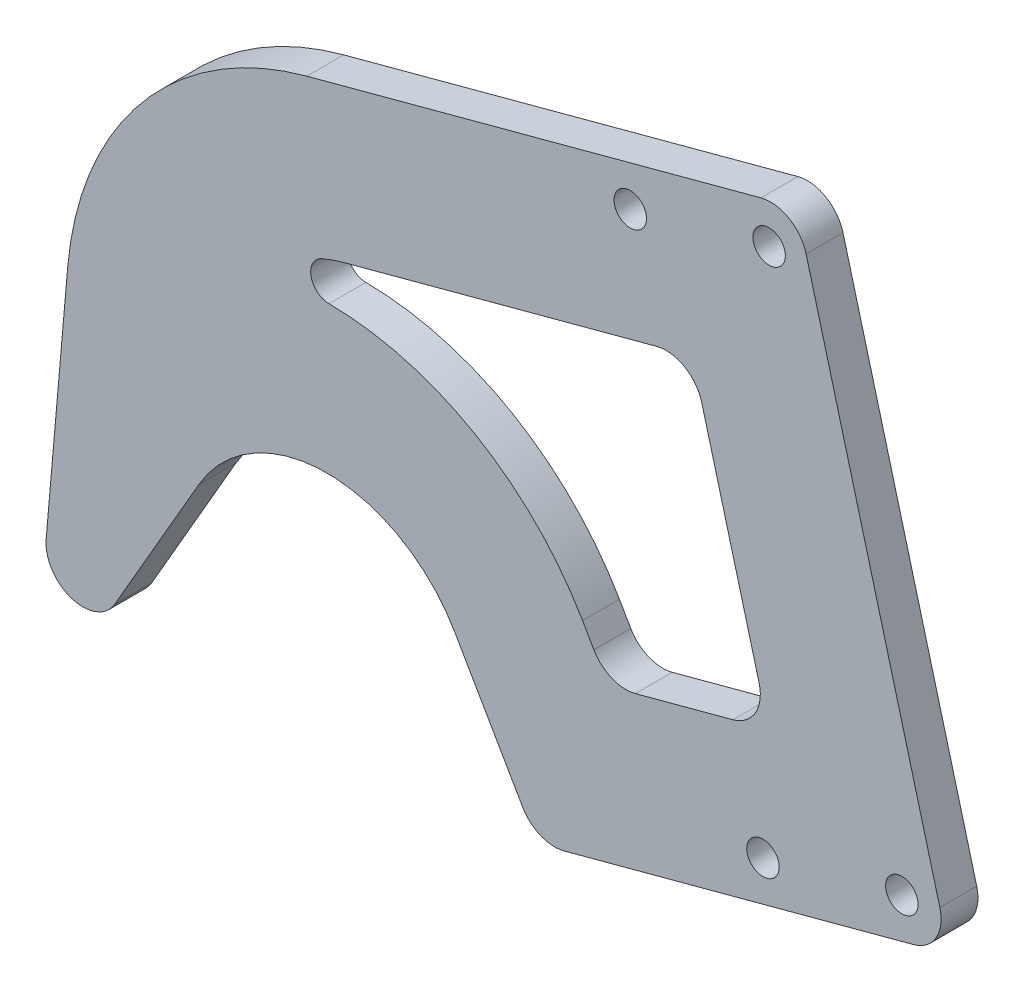
ISO-10303-21;
HEADER;
FILE_DESCRIPTION(('STEP AP214'),'2;1');
FILE_NAME('part.step','',(''),(''),'','','');
FILE_SCHEMA(('AUTOMOTIVE_DESIGN { 1 0 10303 214 1 1 1 1 }'));
ENDSEC;
DATA;
#1=APPLICATION_CONTEXT('core data for automotive mechanical design processes');
#2=APPLICATION_PROTOCOL_DEFINITION('international standard','automotive_design',2000,#1);
#3=PRODUCT_CONTEXT('',#1,'mechanical');
#4=PRODUCT('Part','Part','',(#3));
#5=PRODUCT_RELATED_PRODUCT_CATEGORY('part','',(#4));
#6=PRODUCT_DEFINITION_FORMATION('','',#4);
#7=PRODUCT_DEFINITION_CONTEXT('part definition',#1,'design');
#8=PRODUCT_DEFINITION('design','',#6,#7);
#9=PRODUCT_DEFINITION_SHAPE('','',#8);
#10=(LENGTH_UNIT() NAMED_UNIT(*) SI_UNIT(.MILLI.,.METRE.));
#11=(NAMED_UNIT(*) PLANE_ANGLE_UNIT() SI_UNIT($,.RADIAN.));
#12=(NAMED_UNIT(*) SI_UNIT($,.STERADIAN.) SOLID_ANGLE_UNIT());
#13=UNCERTAINTY_MEASURE_WITH_UNIT(LENGTH_MEASURE(1.E-05),#10,'distance_accuracy_value','');
#14=(GEOMETRIC_REPRESENTATION_CONTEXT(3) GLOBAL_UNCERTAINTY_ASSIGNED_CONTEXT((#13)) GLOBAL_UNIT_ASSIGNED_CONTEXT((#10,
#11,#12)) REPRESENTATION_CONTEXT('',''));
#15=CARTESIAN_POINT('',(0.,0.,0.));
#16=DIRECTION('',(0.,0.,1.));
#17=DIRECTION('',(1.,0.,0.));
#18=AXIS2_PLACEMENT_3D('',#15,#16,#17);
#19=CARTESIAN_POINT('',(0.,17.3058666666666,1.5875));
#20=DIRECTION('',(0.,0.,-1.));
#21=DIRECTION('',(-1.,0.,0.));
#22=AXIS2_PLACEMENT_3D('',#19,#20,#21);
#23=CYLINDRICAL_SURFACE('',#22,12.7);
#24=CARTESIAN_POINT('',(0.,17.3058666666666,-1.5875));
#25=DIRECTION('',(0.,0.,-1.));
#26=DIRECTION('',(-1.,0.,0.));
#27=AXIS2_PLACEMENT_3D('',#24,#25,#26);
#28=CIRCLE('',#27,12.7);
#29=CARTESIAN_POINT('',(-10.9985226280624,23.6558666666666,-1.5875));
#30=VERTEX_POINT('',#29);
#31=CARTESIAN_POINT('',(10.9985226280624,23.6558666666666,-1.5875));
#32=VERTEX_POINT('',#31);
#33=EDGE_CURVE('E258',#30,#32,#28,.T.);
#34=ORIENTED_EDGE('',*,*,#33,.T.);
#35=DIRECTION('',(0.,0.,-1.));
#36=VECTOR('',#35,1.);
#37=CARTESIAN_POINT('',(10.9985226280624,23.6558666666666,1.5875));
#38=LINE('',#37,#36);
#39=CARTESIAN_POINT('',(10.9985226280624,23.6558666666666,1.5875));
#40=VERTEX_POINT('',#39);
#41=EDGE_CURVE('E353',#40,#32,#38,.T.);
#42=ORIENTED_EDGE('',*,*,#41,.F.);
#43=CARTESIAN_POINT('',(0.,17.3058666666666,1.5875));
#44=DIRECTION('',(0.,0.,-1.));
#45=DIRECTION('',(-1.,0.,0.));
#46=AXIS2_PLACEMENT_3D('',#43,#44,#45);
#47=CIRCLE('',#46,12.7);
#48=CARTESIAN_POINT('',(-10.9985226280624,23.6558666666666,1.5875));
#49=VERTEX_POINT('',#48);
#50=EDGE_CURVE('E260',#49,#40,#47,.T.);
#51=ORIENTED_EDGE('',*,*,#50,.F.);
#52=DIRECTION('',(0.,0.,-1.));
#53=VECTOR('',#52,1.);
#54=CARTESIAN_POINT('',(-10.9985226280624,23.6558666666666,1.5875));
#55=LINE('',#54,#53);
#56=EDGE_CURVE('E294',#49,#30,#55,.T.);
#57=ORIENTED_EDGE('',*,*,#56,.T.);
#58=EDGE_LOOP('',(#34,#42,#51,#57));
#59=FACE_BOUND('',#58,.T.);
#60=ADVANCED_FACE('F45',(#59),#23,.F.);
#61=CARTESIAN_POINT('',(10.9985226280624,23.6558666666666,1.5875));
#62=DIRECTION('',(0.866025403784439,0.499999999999999,0.));
#63=DIRECTION('',(-0.499999999999999,0.86602540378444,0.));
#64=AXIS2_PLACEMENT_3D('',#61,#62,#63);
#65=PLANE('',#64);
#66=DIRECTION('',(0.499999999999999,-0.866025403784439,0.));
#67=VECTOR('',#66,1.);
#68=CARTESIAN_POINT('',(10.9985226280624,23.6558666666666,-1.5875));
#69=LINE('',#68,#67);
#70=CARTESIAN_POINT('',(16.8477998671147,13.5246213010718,-1.5875));
#71=VERTEX_POINT('',#70);
#72=EDGE_CURVE('E298',#32,#71,#69,.T.);
#73=ORIENTED_EDGE('',*,*,#72,.T.);
#74=DIRECTION('',(0.,0.,-1.));
#75=VECTOR('',#74,1.);
#76=CARTESIAN_POINT('',(16.8477998671147,13.5246213010718,1.5875));
#77=LINE('',#76,#75);
#78=CARTESIAN_POINT('',(16.8477998671147,13.5246213010718,1.5875));
#79=VERTEX_POINT('',#78);
#80=EDGE_CURVE('E349',#79,#71,#77,.T.);
#81=ORIENTED_EDGE('',*,*,#80,.F.);
#82=DIRECTION('',(0.499999999999999,-0.866025403784439,0.));
#83=VECTOR('',#82,1.);
#84=CARTESIAN_POINT('',(10.9985226280624,23.6558666666666,1.5875));
#85=LINE('',#84,#83);
#86=EDGE_CURVE('E264',#40,#79,#85,.T.);
#87=ORIENTED_EDGE('',*,*,#86,.F.);
#88=ORIENTED_EDGE('',*,*,#41,.T.);
#89=EDGE_LOOP('',(#73,#81,#87,#88));
#90=FACE_BOUND('',#89,.T.);
#91=ADVANCED_FACE('F465',(#90),#65,.F.);
#92=CARTESIAN_POINT('',(19.5974305241302,15.1121213010718,1.5875));
#93=DIRECTION('',(0.,0.,-1.));
#94=DIRECTION('',(-1.,0.,0.));
#95=AXIS2_PLACEMENT_3D('',#92,#93,#94);
#96=CYLINDRICAL_SURFACE('',#95,3.175);
#97=CARTESIAN_POINT('',(19.5974305241302,15.1121213010718,-1.5875));
#98=DIRECTION('',(0.,0.,1.));
#99=DIRECTION('',(1.,0.,0.));
#100=AXIS2_PLACEMENT_3D('',#97,#98,#99);
#101=CIRCLE('',#100,3.175);
#102=CARTESIAN_POINT('',(20.4191809923307,12.045306802604,-1.5875));
#103=VERTEX_POINT('',#102);
#104=EDGE_CURVE('E301',#71,#103,#101,.T.);
#105=ORIENTED_EDGE('',*,*,#104,.T.);
#106=DIRECTION('',(0.,0.,-1.));
#107=VECTOR('',#106,1.);
#108=CARTESIAN_POINT('',(20.4191809923307,12.045306802604,1.5875));
#109=LINE('',#108,#107);
#110=CARTESIAN_POINT('',(20.4191809923307,12.045306802604,1.5875));
#111=VERTEX_POINT('',#110);
#112=EDGE_CURVE('E345',#111,#103,#109,.T.);
#113=ORIENTED_EDGE('',*,*,#112,.F.);
#114=CARTESIAN_POINT('',(19.5974305241302,15.1121213010718,1.5875));
#115=DIRECTION('',(0.,0.,1.));
#116=DIRECTION('',(1.,0.,0.));
#117=AXIS2_PLACEMENT_3D('',#114,#115,#116);
#118=CIRCLE('',#117,3.175);
#119=EDGE_CURVE('E268',#79,#111,#118,.T.);
#120=ORIENTED_EDGE('',*,*,#119,.F.);
#121=ORIENTED_EDGE('',*,*,#80,.T.);
#122=EDGE_LOOP('',(#105,#113,#120,#121));
#123=FACE_BOUND('',#122,.T.);
#124=ADVANCED_FACE('F471',(#123),#96,.T.);
#125=CARTESIAN_POINT('',(20.4191809923308,12.045306802604,1.5875));
#126=DIRECTION('',(-0.258819045102522,0.965925826289068,0.));
#127=DIRECTION('',(-0.965925826289068,-0.258819045102522,0.));
#128=AXIS2_PLACEMENT_3D('',#125,#126,#127);
#129=PLANE('',#128);
#130=DIRECTION('',(0.965925826289068,0.258819045102522,0.));
#131=VECTOR('',#130,1.);
#132=CARTESIAN_POINT('',(20.4191809923308,12.045306802604,-1.5875));
#133=LINE('',#132,#131);
#134=CARTESIAN_POINT('',(50.4923455375514,20.1033869563442,-1.5875));
#135=VERTEX_POINT('',#134);
#136=EDGE_CURVE('E304',#103,#135,#133,.T.);
#137=ORIENTED_EDGE('',*,*,#136,.T.);
#138=DIRECTION('',(0.,0.,-1.));
#139=VECTOR('',#138,1.);
#140=CARTESIAN_POINT('',(50.4923455375514,20.1033869563442,1.5875));
#141=LINE('',#140,#139);
#142=CARTESIAN_POINT('',(50.4923455375514,20.1033869563442,1.5875));
#143=VERTEX_POINT('',#142);
#144=EDGE_CURVE('E370',#135,#143,#141,.F.);
#145=ORIENTED_EDGE('',*,*,#144,.T.);
#146=DIRECTION('',(0.965925826289068,0.258819045102522,0.));
#147=VECTOR('',#146,1.);
#148=CARTESIAN_POINT('',(20.4191809923308,12.045306802604,1.5875));
#149=LINE('',#148,#147);
#150=EDGE_CURVE('E271',#111,#143,#149,.T.);
#151=ORIENTED_EDGE('',*,*,#150,.F.);
#152=ORIENTED_EDGE('',*,*,#112,.T.);
#153=EDGE_LOOP('',(#137,#145,#151,#152));
#154=FACE_BOUND('',#153,.T.);
#155=ADVANCED_FACE('F638',(#154),#129,.F.);
#156=CARTESIAN_POINT('',(53.5591600360192,20.9251374245447,1.5875));
#157=DIRECTION('',(-0.965925826289068,-0.258819045102521,0.));
#158=DIRECTION('',(0.258819045102521,-0.965925826289068,0.));
#159=AXIS2_PLACEMENT_3D('',#156,#157,#158);
#160=PLANE('',#159);
#161=DIRECTION('',(-0.258819045102521,0.965925826289068,0.));
#162=VECTOR('',#161,1.);
#163=CARTESIAN_POINT('',(53.5591600360192,20.9251374245447,1.5875));
#164=LINE('',#163,#162);
#165=CARTESIAN_POINT('',(52.7374095678187,23.9919519230125,1.5875));
#166=VERTEX_POINT('',#165);
#167=CARTESIAN_POINT('',(41.2329030130117,66.9273549015616,1.5875));
#168=VERTEX_POINT('',#167);
#169=EDGE_CURVE('E275',#166,#168,#164,.T.);
#170=ORIENTED_EDGE('',*,*,#169,.F.);
#171=DIRECTION('',(0.,0.,-1.));
#172=VECTOR('',#171,1.);
#173=CARTESIAN_POINT('',(52.7374095678187,23.9919519230125,1.5875));
#174=LINE('',#173,#172);
#175=CARTESIAN_POINT('',(52.7374095678187,23.9919519230125,-1.5875));
#176=VERTEX_POINT('',#175);
#177=EDGE_CURVE('E360',#166,#176,#174,.T.);
#178=ORIENTED_EDGE('',*,*,#177,.T.);
#179=DIRECTION('',(-0.258819045102521,0.965925826289068,0.));
#180=VECTOR('',#179,1.);
#181=CARTESIAN_POINT('',(53.5591600360192,20.9251374245447,-1.5875));
#182=LINE('',#181,#180);
#183=CARTESIAN_POINT('',(41.2329030130117,66.9273549015616,-1.5875));
#184=VERTEX_POINT('',#183);
#185=EDGE_CURVE('E308',#176,#184,#182,.T.);
#186=ORIENTED_EDGE('',*,*,#185,.T.);
#187=DIRECTION('',(0.,0.,-1.));
#188=VECTOR('',#187,1.);
#189=CARTESIAN_POINT('',(41.2329030130116,66.9273549015616,1.5875));
#190=LINE('',#189,#188);
#191=EDGE_CURVE('E357',#184,#168,#190,.F.);
#192=ORIENTED_EDGE('',*,*,#191,.T.);
#193=EDGE_LOOP('',(#170,#178,#186,#192));
#194=FACE_BOUND('',#193,.T.);
#195=ADVANCED_FACE('F629',(#194),#160,.F.);
#196=CARTESIAN_POINT('',(-1.72065451339829,58.7049857231183,1.5875));
#197=DIRECTION('',(0.258819045102522,-0.965925826289068,0.));
#198=DIRECTION('',(0.965925826289068,0.258819045102522,0.));
#199=AXIS2_PLACEMENT_3D('',#196,#197,#198);
#200=PLANE('',#199);
#201=DIRECTION('',(-0.965925826289068,-0.258819045102522,0.));
#202=VECTOR('',#201,1.);
#203=CARTESIAN_POINT('',(-1.72065451339829,58.7049857231183,1.5875));
#204=LINE('',#203,#202);
#205=CARTESIAN_POINT('',(37.3443380463433,69.1724189318289,1.5875));
#206=VERTEX_POINT('',#205);
#207=CARTESIAN_POINT('',(-1.72065451339829,58.7049857231183,1.5875));
#208=VERTEX_POINT('',#207);
#209=EDGE_CURVE('E279',#206,#208,#204,.T.);
#210=ORIENTED_EDGE('',*,*,#209,.F.);
#211=DIRECTION('',(0.,0.,-1.));
#212=VECTOR('',#211,1.);
#213=CARTESIAN_POINT('',(37.3443380463433,69.1724189318289,1.5875));
#214=LINE('',#213,#212);
#215=CARTESIAN_POINT('',(37.3443380463433,69.1724189318289,-1.5875));
#216=VERTEX_POINT('',#215);
#217=EDGE_CURVE('E379',#206,#216,#214,.T.);
#218=ORIENTED_EDGE('',*,*,#217,.T.);
#219=DIRECTION('',(-0.965925826289068,-0.258819045102522,0.));
#220=VECTOR('',#219,1.);
#221=CARTESIAN_POINT('',(-1.72065451339829,58.7049857231183,-1.5875));
#222=LINE('',#221,#220);
#223=CARTESIAN_POINT('',(-1.72065451339829,58.7049857231183,-1.5875));
#224=VERTEX_POINT('',#223);
#225=EDGE_CURVE('E312',#216,#224,#222,.T.);
#226=ORIENTED_EDGE('',*,*,#225,.T.);
#227=DIRECTION('',(0.,0.,-1.));
#228=VECTOR('',#227,1.);
#229=CARTESIAN_POINT('',(-1.72065451339829,58.7049857231183,1.5875));
#230=LINE('',#229,#228);
#231=EDGE_CURVE('E341',#208,#224,#230,.T.);
#232=ORIENTED_EDGE('',*,*,#231,.F.);
#233=EDGE_LOOP('',(#210,#218,#226,#232));
#234=FACE_BOUND('',#233,.T.);
#235=ADVANCED_FACE('F624',(#234),#200,.F.);
#236=CARTESIAN_POINT('',(5.50191214310372,31.75,1.5875));
#237=DIRECTION('',(0.,0.,-1.));
#238=DIRECTION('',(-1.,0.,0.));
#239=AXIS2_PLACEMENT_3D('',#236,#237,#238);
#240=CYLINDRICAL_SURFACE('',#239,27.9058546624382);
#241=CARTESIAN_POINT('',(5.50191214310372,31.75,-1.5875));
#242=DIRECTION('',(0.,0.,1.));
#243=DIRECTION('',(1.,0.,0.));
#244=AXIS2_PLACEMENT_3D('',#241,#242,#243);
#245=CIRCLE('',#244,27.9058546624382);
#246=CARTESIAN_POINT('',(-22.297752317336,34.1821554901132,-1.5875));
#247=VERTEX_POINT('',#246);
#248=EDGE_CURVE('E315',#224,#247,#245,.T.);
#249=ORIENTED_EDGE('',*,*,#248,.T.);
#250=DIRECTION('',(0.,0.,-1.));
#251=VECTOR('',#250,1.);
#252=CARTESIAN_POINT('',(-22.297752317336,34.1821554901132,1.5875));
#253=LINE('',#252,#251);
#254=CARTESIAN_POINT('',(-22.297752317336,34.1821554901132,1.5875));
#255=VERTEX_POINT('',#254);
#256=EDGE_CURVE('E337',#255,#247,#253,.T.);
#257=ORIENTED_EDGE('',*,*,#256,.F.);
#258=CARTESIAN_POINT('',(5.50191214310372,31.75,1.5875));
#259=DIRECTION('',(0.,0.,1.));
#260=DIRECTION('',(1.,0.,0.));
#261=AXIS2_PLACEMENT_3D('',#258,#259,#260);
#262=CIRCLE('',#261,27.9058546624382);
#263=EDGE_CURVE('E282',#208,#255,#262,.T.);
#264=ORIENTED_EDGE('',*,*,#263,.F.);
#265=ORIENTED_EDGE('',*,*,#231,.T.);
#266=EDGE_LOOP('',(#249,#257,#264,#265));
#267=FACE_BOUND('',#266,.T.);
#268=ADVANCED_FACE('F628',(#267),#240,.T.);
#269=CARTESIAN_POINT('',(-24.1529875730634,12.9767194832238,1.5875));
#270=DIRECTION('',(0.996194698091745,-0.0871557427476642,0.));
#271=DIRECTION('',(0.0871557427476642,0.996194698091745,0.));
#272=AXIS2_PLACEMENT_3D('',#269,#270,#271);
#273=PLANE('',#272);
#274=DIRECTION('',(-0.0871557427476642,-0.996194698091745,0.));
#275=VECTOR('',#274,1.);
#276=CARTESIAN_POINT('',(-24.1529875730634,12.9767194832238,-1.5875));
#277=LINE('',#276,#275);
#278=CARTESIAN_POINT('',(-24.1529875730634,12.9767194832238,-1.5875));
#279=VERTEX_POINT('',#278);
#280=EDGE_CURVE('E318',#247,#279,#277,.T.);
#281=ORIENTED_EDGE('',*,*,#280,.T.);
#282=DIRECTION('',(0.,0.,-1.));
#283=VECTOR('',#282,1.);
#284=CARTESIAN_POINT('',(-24.1529875730634,12.9767194832238,1.5875));
#285=LINE('',#284,#283);
#286=CARTESIAN_POINT('',(-24.1529875730634,12.9767194832238,1.5875));
#287=VERTEX_POINT('',#286);
#288=EDGE_CURVE('E333',#287,#279,#285,.T.);
#289=ORIENTED_EDGE('',*,*,#288,.F.);
#290=DIRECTION('',(-0.0871557427476642,-0.996194698091745,0.));
#291=VECTOR('',#290,1.);
#292=CARTESIAN_POINT('',(-24.1529875730634,12.9767194832238,1.5875));
#293=LINE('',#292,#291);
#294=EDGE_CURVE('E285',#255,#287,#293,.T.);
#295=ORIENTED_EDGE('',*,*,#294,.F.);
#296=ORIENTED_EDGE('',*,*,#256,.T.);
#297=EDGE_LOOP('',(#281,#289,#295,#296));
#298=FACE_BOUND('',#297,.T.);
#299=ADVANCED_FACE('F673',(#298),#273,.F.);
#300=CARTESIAN_POINT('',(-20.9900694066221,12.7,1.5875));
#301=DIRECTION('',(0.,0.,-1.));
#302=DIRECTION('',(-1.,0.,0.));
#303=AXIS2_PLACEMENT_3D('',#300,#301,#302);
#304=CYLINDRICAL_SURFACE('',#303,3.175);
#305=CARTESIAN_POINT('',(-20.9900694066221,12.7,-1.5875));
#306=DIRECTION('',(0.,0.,1.));
#307=DIRECTION('',(1.,0.,0.));
#308=AXIS2_PLACEMENT_3D('',#305,#306,#307);
#309=CIRCLE('',#308,3.175);
#310=CARTESIAN_POINT('',(-18.2404387496065,11.1125,-1.5875));
#311=VERTEX_POINT('',#310);
#312=EDGE_CURVE('E321',#279,#311,#309,.T.);
#313=ORIENTED_EDGE('',*,*,#312,.T.);
#314=DIRECTION('',(0.,0.,-1.));
#315=VECTOR('',#314,1.);
#316=CARTESIAN_POINT('',(-18.2404387496065,11.1125,1.5875));
#317=LINE('',#316,#315);
#318=CARTESIAN_POINT('',(-18.2404387496065,11.1125,1.5875));
#319=VERTEX_POINT('',#318);
#320=EDGE_CURVE('E329',#319,#311,#317,.T.);
#321=ORIENTED_EDGE('',*,*,#320,.F.);
#322=CARTESIAN_POINT('',(-20.9900694066221,12.7,1.5875));
#323=DIRECTION('',(0.,0.,1.));
#324=DIRECTION('',(1.,0.,0.));
#325=AXIS2_PLACEMENT_3D('',#322,#323,#324);
#326=CIRCLE('',#325,3.175);
#327=EDGE_CURVE('E288',#287,#319,#326,.T.);
#328=ORIENTED_EDGE('',*,*,#327,.F.);
#329=ORIENTED_EDGE('',*,*,#288,.T.);
#330=EDGE_LOOP('',(#313,#321,#328,#329));
#331=FACE_BOUND('',#330,.T.);
#332=ADVANCED_FACE('F682',(#331),#304,.T.);
#333=CARTESIAN_POINT('',(-10.9985226280624,23.6558666666666,1.5875));
#334=DIRECTION('',(-0.866025403784439,0.5,0.));
#335=DIRECTION('',(-0.5,-0.866025403784439,0.));
#336=AXIS2_PLACEMENT_3D('',#333,#334,#335);
#337=PLANE('',#336);
#338=DIRECTION('',(0.5,0.866025403784439,0.));
#339=VECTOR('',#338,1.);
#340=CARTESIAN_POINT('',(-10.9985226280624,23.6558666666666,-1.5875));
#341=LINE('',#340,#339);
#342=EDGE_CURVE('E265',#311,#30,#341,.T.);
#343=ORIENTED_EDGE('',*,*,#342,.T.);
#344=ORIENTED_EDGE('',*,*,#56,.F.);
#345=DIRECTION('',(0.5,0.866025403784439,0.));
#346=VECTOR('',#345,1.);
#347=CARTESIAN_POINT('',(-10.9985226280624,23.6558666666666,1.5875));
#348=LINE('',#347,#346);
#349=EDGE_CURVE('E291',#319,#49,#348,.T.);
#350=ORIENTED_EDGE('',*,*,#349,.F.);
#351=ORIENTED_EDGE('',*,*,#320,.T.);
#352=EDGE_LOOP('',(#343,#344,#350,#351));
#353=FACE_BOUND('',#352,.T.);
#354=ADVANCED_FACE('F504',(#353),#337,.F.);
#355=CARTESIAN_POINT('',(0.,17.3058666666666,1.5875));
#356=DIRECTION('',(0.,0.,-1.));
#357=DIRECTION('',(-1.,0.,0.));
#358=AXIS2_PLACEMENT_3D('',#355,#356,#357);
#359=PLANE('',#358);
#360=CARTESIAN_POINT('',(37.5200804050536,20.0854049602765,1.5875));
#361=DIRECTION('',(0.,0.,-1.));
#362=DIRECTION('',(-1.,0.,0.));
#363=AXIS2_PLACEMENT_3D('',#360,#361,#362);
#364=CIRCLE('',#363,1.39699999999982);
#365=CARTESIAN_POINT('',(36.1230804050538,20.0854049602765,1.5875));
#366=VERTEX_POINT('',#365);
#367=EDGE_CURVE('E239',#366,#366,#364,.T.);
#368=ORIENTED_EDGE('',*,*,#367,.T.);
#369=EDGE_LOOP('',(#368));
#370=FACE_BOUND('',#369,.T.);
#371=CARTESIAN_POINT('',(26.1010358989393,62.701859230985,1.5875));
#372=DIRECTION('',(0.,0.,-1.));
#373=DIRECTION('',(-1.,0.,0.));
#374=AXIS2_PLACEMENT_3D('',#371,#372,#373);
#375=CIRCLE('',#374,1.39699999999982);
#376=CARTESIAN_POINT('',(24.7040358989395,62.701859230985,1.5875));
#377=VERTEX_POINT('',#376);
#378=EDGE_CURVE('E759',#377,#377,#375,.T.);
#379=ORIENTED_EDGE('',*,*,#378,.T.);
#380=EDGE_LOOP('',(#379));
#381=FACE_BOUND('',#380,.T.);
#382=CARTESIAN_POINT('',(38.0493451849699,65.9033990550941,1.5875));
#383=DIRECTION('',(0.,0.,-1.));
#384=DIRECTION('',(-1.,0.,0.));
#385=AXIS2_PLACEMENT_3D('',#382,#383,#384);
#386=CIRCLE('',#385,1.39699999999981);
#387=CARTESIAN_POINT('',(36.6523451849701,65.9033990550941,1.5875));
#388=VERTEX_POINT('',#387);
#389=EDGE_CURVE('E769',#388,#388,#386,.T.);
#390=ORIENTED_EDGE('',*,*,#389,.T.);
#391=EDGE_LOOP('',(#390));
#392=FACE_BOUND('',#391,.T.);
#393=CARTESIAN_POINT('',(49.4683896910841,23.2869447843857,1.5875));
#394=DIRECTION('',(0.,0.,-1.));
#395=DIRECTION('',(-1.,0.,0.));
#396=AXIS2_PLACEMENT_3D('',#393,#394,#395);
#397=CIRCLE('',#396,1.39699999999982);
#398=CARTESIAN_POINT('',(48.0713896910843,23.2869447843857,1.5875));
#399=VERTEX_POINT('',#398);
#400=EDGE_CURVE('E776',#399,#399,#397,.T.);
#401=ORIENTED_EDGE('',*,*,#400,.T.);
#402=EDGE_LOOP('',(#401));
#403=FACE_BOUND('',#402,.T.);
#404=CARTESIAN_POINT('',(5.50191214310372,31.75,1.5875));
#405=DIRECTION('',(0.,0.,1.));
#406=DIRECTION('',(1.,0.,0.));
#407=AXIS2_PLACEMENT_3D('',#404,#405,#406);
#408=CIRCLE('',#407,15.2058546624382);
#409=CARTESIAN_POINT('',(1.56634735940374,46.4377277292471,1.5875));
#410=VERTEX_POINT('',#409);
#411=CARTESIAN_POINT('',(-0.421343194027553,45.7547514160852,1.5875));
#412=VERTEX_POINT('',#411);
#413=EDGE_CURVE('E238',#410,#412,#408,.T.);
#414=ORIENTED_EDGE('',*,*,#413,.F.);
#415=DIRECTION('',(-0.965925826289068,-0.258819045102522,0.));
#416=VECTOR('',#415,1.);
#417=CARTESIAN_POINT('',(31.430896423742,54.4399095333562,1.5875));
#418=LINE('',#417,#416);
#419=CARTESIAN_POINT('',(28.3640819252742,53.6181590651557,1.5875));
#420=VERTEX_POINT('',#419);
#421=EDGE_CURVE('E213',#420,#410,#418,.T.);
#422=ORIENTED_EDGE('',*,*,#421,.F.);
#423=CARTESIAN_POINT('',(29.1858323934747,50.5513445666879,1.5875));
#424=DIRECTION('',(0.,0.,-1.));
#425=DIRECTION('',(-1.,0.,0.));
#426=AXIS2_PLACEMENT_3D('',#423,#424,#425);
#427=CIRCLE('',#426,3.175);
#428=CARTESIAN_POINT('',(32.2526468919425,51.3730950348884,1.5875));
#429=VERTEX_POINT('',#428);
#430=EDGE_CURVE('E403',#420,#429,#427,.T.);
#431=ORIENTED_EDGE('',*,*,#430,.T.);
#432=DIRECTION('',(-0.258819045102521,0.965925826289068,0.));
#433=VECTOR('',#432,1.);
#434=CARTESIAN_POINT('',(38.004900169346,29.9053935456138,1.5875));
#435=LINE('',#434,#433);
#436=CARTESIAN_POINT('',(37.1831497011455,32.9722080440816,1.5875));
#437=VERTEX_POINT('',#436);
#438=EDGE_CURVE('E207',#437,#429,#435,.T.);
#439=ORIENTED_EDGE('',*,*,#438,.F.);
#440=CARTESIAN_POINT('',(34.1163352026777,32.1504575758811,1.5875));
#441=DIRECTION('',(0.,0.,-1.));
#442=DIRECTION('',(-1.,0.,0.));
#443=AXIS2_PLACEMENT_3D('',#440,#441,#442);
#444=CIRCLE('',#443,3.175);
#445=CARTESIAN_POINT('',(34.9380856708783,29.0836430774133,1.5875));
#446=VERTEX_POINT('',#445);
#447=EDGE_CURVE('E408',#437,#446,#444,.T.);
#448=ORIENTED_EDGE('',*,*,#447,.T.);
#449=DIRECTION('',(0.965925826289068,0.258819045102521,0.));
#450=VECTOR('',#449,1.);
#451=CARTESIAN_POINT('',(24.1919277149272,26.204218731379,1.5875));
#452=LINE('',#451,#450);
#453=CARTESIAN_POINT('',(26.5451772467267,26.8347700430136,1.5875));
#454=VERTEX_POINT('',#453);
#455=EDGE_CURVE('E249',#454,#446,#452,.T.);
#456=ORIENTED_EDGE('',*,*,#455,.F.);
#457=CARTESIAN_POINT('',(25.7234267785262,29.9015845414814,1.5875));
#458=DIRECTION('',(0.,0.,-1.));
#459=DIRECTION('',(-1.,0.,0.));
#460=AXIS2_PLACEMENT_3D('',#457,#458,#459);
#461=CIRCLE('',#460,3.175);
#462=CARTESIAN_POINT('',(22.9737961215106,28.3140845414814,1.5875));
#463=VERTEX_POINT('',#462);
#464=EDGE_CURVE('E414',#454,#463,#461,.T.);
#465=ORIENTED_EDGE('',*,*,#464,.T.);
#466=DIRECTION('',(0.499999999999998,-0.866025403784439,0.));
#467=VECTOR('',#466,1.);
#468=CARTESIAN_POINT('',(21.9970452561247,30.0058666666666,1.5875));
#469=LINE('',#468,#467);
#470=CARTESIAN_POINT('',(21.9970452561247,30.0058666666666,1.5875));
#471=VERTEX_POINT('',#470);
#472=EDGE_CURVE('E245',#471,#463,#469,.T.);
#473=ORIENTED_EDGE('',*,*,#472,.F.);
#474=CARTESIAN_POINT('',(0.,17.3058666666666,1.5875));
#475=DIRECTION('',(0.,0.,-1.));
#476=DIRECTION('',(1.,0.,0.));
#477=AXIS2_PLACEMENT_3D('',#474,#475,#476);
#478=CIRCLE('',#477,25.4);
#479=CARTESIAN_POINT('',(0.185457017108914,42.7051896043908,1.5875));
#480=VERTEX_POINT('',#479);
#481=EDGE_CURVE('E242',#480,#471,#478,.T.);
#482=ORIENTED_EDGE('',*,*,#481,.F.);
#483=CARTESIAN_POINT('',(0.197048080678221,44.2926472879986,1.5875));
#484=DIRECTION('',(0.,0.,-1.));
#485=DIRECTION('',(-1.,0.,0.));
#486=AXIS2_PLACEMENT_3D('',#483,#484,#485);
#487=CIRCLE('',#486,1.5875);
#488=EDGE_CURVE('E54',#480,#412,#487,.T.);
#489=ORIENTED_EDGE('',*,*,#488,.T.);
#490=EDGE_LOOP('',(#414,#422,#431,#439,#448,#456,#465,#473,#482,#489));
#491=FACE_BOUND('',#490,.T.);
#492=ORIENTED_EDGE('',*,*,#150,.T.);
#493=CARTESIAN_POINT('',(49.6705950693509,23.170201454812,1.5875));
#494=DIRECTION('',(0.,0.,-1.));
#495=DIRECTION('',(-1.,0.,0.));
#496=AXIS2_PLACEMENT_3D('',#493,#494,#495);
#497=CIRCLE('',#496,3.175);
#498=EDGE_CURVE('E376',#143,#166,#497,.F.);
#499=ORIENTED_EDGE('',*,*,#498,.T.);
#500=ORIENTED_EDGE('',*,*,#169,.T.);
#501=CARTESIAN_POINT('',(38.1660885145438,66.1056044333611,1.5875));
#502=DIRECTION('',(0.,0.,-1.));
#503=DIRECTION('',(-1.,0.,0.));
#504=AXIS2_PLACEMENT_3D('',#501,#502,#503);
#505=CIRCLE('',#504,3.175);
#506=EDGE_CURVE('E373',#168,#206,#505,.F.);
#507=ORIENTED_EDGE('',*,*,#506,.T.);
#508=ORIENTED_EDGE('',*,*,#209,.T.);
#509=ORIENTED_EDGE('',*,*,#263,.T.);
#510=ORIENTED_EDGE('',*,*,#294,.T.);
#511=ORIENTED_EDGE('',*,*,#327,.T.);
#512=ORIENTED_EDGE('',*,*,#349,.T.);
#513=ORIENTED_EDGE('',*,*,#50,.T.);
#514=ORIENTED_EDGE('',*,*,#86,.T.);
#515=ORIENTED_EDGE('',*,*,#119,.T.);
#516=EDGE_LOOP('',(#492,#499,#500,#507,#508,#509,#510,#511,#512,#513,#514,#515));
#517=FACE_BOUND('',#516,.T.);
#518=ADVANCED_FACE('F433',(#370,#381,#392,#403,#491,#517),#359,.F.);
#519=CARTESIAN_POINT('',(0.,17.3058666666666,-1.5875));
#520=DIRECTION('',(0.,0.,-1.));
#521=DIRECTION('',(-1.,0.,0.));
#522=AXIS2_PLACEMENT_3D('',#519,#520,#521);
#523=PLANE('',#522);
#524=CARTESIAN_POINT('',(37.5200804050536,20.0854049602765,-1.5875));
#525=DIRECTION('',(0.,0.,-1.));
#526=DIRECTION('',(-1.,0.,0.));
#527=AXIS2_PLACEMENT_3D('',#524,#525,#526);
#528=CIRCLE('',#527,1.39699999999982);
#529=CARTESIAN_POINT('',(36.1230804050538,20.0854049602765,-1.5875));
#530=VERTEX_POINT('',#529);
#531=EDGE_CURVE('E751',#530,#530,#528,.T.);
#532=ORIENTED_EDGE('',*,*,#531,.F.);
#533=EDGE_LOOP('',(#532));
#534=FACE_BOUND('',#533,.T.);
#535=CARTESIAN_POINT('',(26.1010358989393,62.701859230985,-1.5875));
#536=DIRECTION('',(0.,0.,-1.));
#537=DIRECTION('',(-1.,0.,0.));
#538=AXIS2_PLACEMENT_3D('',#535,#536,#537);
#539=CIRCLE('',#538,1.39699999999982);
#540=CARTESIAN_POINT('',(24.7040358989395,62.701859230985,-1.5875));
#541=VERTEX_POINT('',#540);
#542=EDGE_CURVE('E753',#541,#541,#539,.T.);
#543=ORIENTED_EDGE('',*,*,#542,.F.);
#544=EDGE_LOOP('',(#543));
#545=FACE_BOUND('',#544,.T.);
#546=CARTESIAN_POINT('',(38.0493451849699,65.9033990550941,-1.5875));
#547=DIRECTION('',(0.,0.,-1.));
#548=DIRECTION('',(-1.,0.,0.));
#549=AXIS2_PLACEMENT_3D('',#546,#547,#548);
#550=CIRCLE('',#549,1.39699999999981);
#551=CARTESIAN_POINT('',(36.6523451849701,65.9033990550941,-1.5875));
#552=VERTEX_POINT('',#551);
#553=EDGE_CURVE('E765',#552,#552,#550,.T.);
#554=ORIENTED_EDGE('',*,*,#553,.F.);
#555=EDGE_LOOP('',(#554));
#556=FACE_BOUND('',#555,.T.);
#557=CARTESIAN_POINT('',(49.4683896910841,23.2869447843857,-1.5875));
#558=DIRECTION('',(0.,0.,-1.));
#559=DIRECTION('',(-1.,0.,0.));
#560=AXIS2_PLACEMENT_3D('',#557,#558,#559);
#561=CIRCLE('',#560,1.39699999999982);
#562=CARTESIAN_POINT('',(48.0713896910843,23.2869447843857,-1.5875));
#563=VERTEX_POINT('',#562);
#564=EDGE_CURVE('E773',#563,#563,#561,.T.);
#565=ORIENTED_EDGE('',*,*,#564,.F.);
#566=EDGE_LOOP('',(#565));
#567=FACE_BOUND('',#566,.T.);
#568=DIRECTION('',(-0.258819045102521,0.965925826289068,0.));
#569=VECTOR('',#568,1.);
#570=CARTESIAN_POINT('',(38.004900169346,29.9053935456138,-1.5875));
#571=LINE('',#570,#569);
#572=CARTESIAN_POINT('',(37.1831497011455,32.9722080440816,-1.5875));
#573=VERTEX_POINT('',#572);
#574=CARTESIAN_POINT('',(32.2526468919425,51.3730950348884,-1.5875));
#575=VERTEX_POINT('',#574);
#576=EDGE_CURVE('E216',#573,#575,#571,.T.);
#577=ORIENTED_EDGE('',*,*,#576,.T.);
#578=CARTESIAN_POINT('',(29.1858323934747,50.5513445666879,-1.5875));
#579=DIRECTION('',(0.,0.,-1.));
#580=DIRECTION('',(-1.,0.,0.));
#581=AXIS2_PLACEMENT_3D('',#578,#579,#580);
#582=CIRCLE('',#581,3.175);
#583=CARTESIAN_POINT('',(28.3640819252742,53.6181590651557,-1.5875));
#584=VERTEX_POINT('',#583);
#585=EDGE_CURVE('E202',#575,#584,#582,.F.);
#586=ORIENTED_EDGE('',*,*,#585,.T.);
#587=DIRECTION('',(-0.965925826289068,-0.258819045102522,0.));
#588=VECTOR('',#587,1.);
#589=CARTESIAN_POINT('',(31.430896423742,54.4399095333562,-1.5875));
#590=LINE('',#589,#588);
#591=CARTESIAN_POINT('',(1.56634735940374,46.4377277292471,-1.5875));
#592=VERTEX_POINT('',#591);
#593=EDGE_CURVE('E194',#584,#592,#590,.T.);
#594=ORIENTED_EDGE('',*,*,#593,.T.);
#595=CARTESIAN_POINT('',(5.50191214310372,31.75,-1.5875));
#596=DIRECTION('',(0.,0.,1.));
#597=DIRECTION('',(1.,0.,0.));
#598=AXIS2_PLACEMENT_3D('',#595,#596,#597);
#599=CIRCLE('',#598,15.2058546624382);
#600=CARTESIAN_POINT('',(-0.421343194027553,45.7547514160852,-1.5875));
#601=VERTEX_POINT('',#600);
#602=EDGE_CURVE('E199',#592,#601,#599,.T.);
#603=ORIENTED_EDGE('',*,*,#602,.T.);
#604=CARTESIAN_POINT('',(0.197048080678221,44.2926472879986,-1.5875));
#605=DIRECTION('',(0.,0.,-1.));
#606=DIRECTION('',(-1.,0.,0.));
#607=AXIS2_PLACEMENT_3D('',#604,#605,#606);
#608=CIRCLE('',#607,1.5875);
#609=CARTESIAN_POINT('',(0.185457017108914,42.7051896043908,-1.5875));
#610=VERTEX_POINT('',#609);
#611=EDGE_CURVE('E11',#601,#610,#608,.F.);
#612=ORIENTED_EDGE('',*,*,#611,.T.);
#613=CARTESIAN_POINT('',(0.,17.3058666666666,-1.5875));
#614=DIRECTION('',(0.,0.,-1.));
#615=DIRECTION('',(1.,0.,0.));
#616=AXIS2_PLACEMENT_3D('',#613,#614,#615);
#617=CIRCLE('',#616,25.4);
#618=CARTESIAN_POINT('',(21.9970452561247,30.0058666666666,-1.5875));
#619=VERTEX_POINT('',#618);
#620=EDGE_CURVE('E220',#610,#619,#617,.T.);
#621=ORIENTED_EDGE('',*,*,#620,.T.);
#622=DIRECTION('',(0.499999999999998,-0.866025403784439,0.));
#623=VECTOR('',#622,1.);
#624=CARTESIAN_POINT('',(21.9970452561247,30.0058666666666,-1.5875));
#625=LINE('',#624,#623);
#626=CARTESIAN_POINT('',(22.9737961215106,28.3140845414814,-1.5875));
#627=VERTEX_POINT('',#626);
#628=EDGE_CURVE('E223',#619,#627,#625,.T.);
#629=ORIENTED_EDGE('',*,*,#628,.T.);
#630=CARTESIAN_POINT('',(25.7234267785262,29.9015845414814,-1.5875));
#631=DIRECTION('',(0.,0.,-1.));
#632=DIRECTION('',(-1.,0.,0.));
#633=AXIS2_PLACEMENT_3D('',#630,#631,#632);
#634=CIRCLE('',#633,3.175);
#635=CARTESIAN_POINT('',(26.5451772467267,26.8347700430136,-1.5875));
#636=VERTEX_POINT('',#635);
#637=EDGE_CURVE('E417',#627,#636,#634,.F.);
#638=ORIENTED_EDGE('',*,*,#637,.T.);
#639=DIRECTION('',(0.965925826289068,0.258819045102521,0.));
#640=VECTOR('',#639,1.);
#641=CARTESIAN_POINT('',(24.1919277149272,26.204218731379,-1.5875));
#642=LINE('',#641,#640);
#643=CARTESIAN_POINT('',(34.9380856708783,29.0836430774133,-1.5875));
#644=VERTEX_POINT('',#643);
#645=EDGE_CURVE('E230',#636,#644,#642,.T.);
#646=ORIENTED_EDGE('',*,*,#645,.T.);
#647=CARTESIAN_POINT('',(34.1163352026777,32.1504575758811,-1.5875));
#648=DIRECTION('',(0.,0.,-1.));
#649=DIRECTION('',(-1.,0.,0.));
#650=AXIS2_PLACEMENT_3D('',#647,#648,#649);
#651=CIRCLE('',#650,3.175);
#652=EDGE_CURVE('E411',#644,#573,#651,.F.);
#653=ORIENTED_EDGE('',*,*,#652,.T.);
#654=EDGE_LOOP('',(#577,#586,#594,#603,#612,#621,#629,#638,#646,#653));
#655=FACE_BOUND('',#654,.T.);
#656=ORIENTED_EDGE('',*,*,#185,.F.);
#657=CARTESIAN_POINT('',(49.6705950693509,23.170201454812,-1.5875));
#658=DIRECTION('',(0.,0.,-1.));
#659=DIRECTION('',(-1.,0.,0.));
#660=AXIS2_PLACEMENT_3D('',#657,#658,#659);
#661=CIRCLE('',#660,3.175);
#662=EDGE_CURVE('E367',#176,#135,#661,.T.);
#663=ORIENTED_EDGE('',*,*,#662,.T.);
#664=ORIENTED_EDGE('',*,*,#136,.F.);
#665=ORIENTED_EDGE('',*,*,#104,.F.);
#666=ORIENTED_EDGE('',*,*,#72,.F.);
#667=ORIENTED_EDGE('',*,*,#33,.F.);
#668=ORIENTED_EDGE('',*,*,#342,.F.);
#669=ORIENTED_EDGE('',*,*,#312,.F.);
#670=ORIENTED_EDGE('',*,*,#280,.F.);
#671=ORIENTED_EDGE('',*,*,#248,.F.);
#672=ORIENTED_EDGE('',*,*,#225,.F.);
#673=CARTESIAN_POINT('',(38.1660885145438,66.1056044333611,-1.5875));
#674=DIRECTION('',(0.,0.,-1.));
#675=DIRECTION('',(-1.,0.,0.));
#676=AXIS2_PLACEMENT_3D('',#673,#674,#675);
#677=CIRCLE('',#676,3.175);
#678=EDGE_CURVE('E364',#216,#184,#677,.T.);
#679=ORIENTED_EDGE('',*,*,#678,.T.);
#680=EDGE_LOOP('',(#656,#663,#664,#665,#666,#667,#668,#669,#670,#671,#672,#679));
#681=FACE_BOUND('',#680,.T.);
#682=ADVANCED_FACE('F197',(#534,#545,#556,#567,#655,#681),#523,.T.);
#683=CARTESIAN_POINT('',(31.430896423742,54.4399095333562,-1.5875));
#684=DIRECTION('',(-0.258819045102522,0.965925826289068,0.));
#685=DIRECTION('',(-0.965925826289068,-0.258819045102522,0.));
#686=AXIS2_PLACEMENT_3D('',#683,#684,#685);
#687=PLANE('',#686);
#688=ORIENTED_EDGE('',*,*,#593,.F.);
#689=DIRECTION('',(0.,0.,1.));
#690=VECTOR('',#689,1.);
#691=CARTESIAN_POINT('',(28.3640819252742,53.6181590651557,1.5875));
#692=LINE('',#691,#690);
#693=EDGE_CURVE('E383',#584,#420,#692,.T.);
#694=ORIENTED_EDGE('',*,*,#693,.T.);
#695=ORIENTED_EDGE('',*,*,#421,.T.);
#696=DIRECTION('',(0.,0.,1.));
#697=VECTOR('',#696,1.);
#698=CARTESIAN_POINT('',(1.56634735940374,46.4377277292471,-1.5875));
#699=LINE('',#698,#697);
#700=EDGE_CURVE('E210',#592,#410,#699,.T.);
#701=ORIENTED_EDGE('',*,*,#700,.F.);
#702=EDGE_LOOP('',(#688,#694,#695,#701));
#703=FACE_BOUND('',#702,.T.);
#704=ADVANCED_FACE('F211',(#703),#687,.F.);
#705=CARTESIAN_POINT('',(38.004900169346,29.9053935456138,-1.5875));
#706=DIRECTION('',(0.965925826289068,0.258819045102521,0.));
#707=DIRECTION('',(-0.258819045102521,0.965925826289068,0.));
#708=AXIS2_PLACEMENT_3D('',#705,#706,#707);
#709=PLANE('',#708);
#710=ORIENTED_EDGE('',*,*,#438,.T.);
#711=DIRECTION('',(0.,0.,1.));
#712=VECTOR('',#711,1.);
#713=CARTESIAN_POINT('',(32.2526468919425,51.3730950348884,-1.5875));
#714=LINE('',#713,#712);
#715=EDGE_CURVE('E390',#429,#575,#714,.F.);
#716=ORIENTED_EDGE('',*,*,#715,.T.);
#717=ORIENTED_EDGE('',*,*,#576,.F.);
#718=DIRECTION('',(0.,0.,1.));
#719=VECTOR('',#718,1.);
#720=CARTESIAN_POINT('',(37.1831497011455,32.9722080440816,1.5875));
#721=LINE('',#720,#719);
#722=EDGE_CURVE('E386',#573,#437,#721,.T.);
#723=ORIENTED_EDGE('',*,*,#722,.T.);
#724=EDGE_LOOP('',(#710,#716,#717,#723));
#725=FACE_BOUND('',#724,.T.);
#726=ADVANCED_FACE('F454',(#725),#709,.F.);
#727=CARTESIAN_POINT('',(24.1919277149272,26.204218731379,-1.5875));
#728=DIRECTION('',(0.258819045102521,-0.965925826289068,0.));
#729=DIRECTION('',(0.965925826289068,0.258819045102521,0.));
#730=AXIS2_PLACEMENT_3D('',#727,#728,#729);
#731=PLANE('',#730);
#732=ORIENTED_EDGE('',*,*,#455,.T.);
#733=DIRECTION('',(0.,0.,1.));
#734=VECTOR('',#733,1.);
#735=CARTESIAN_POINT('',(34.9380856708783,29.0836430774133,-1.5875));
#736=LINE('',#735,#734);
#737=EDGE_CURVE('E397',#446,#644,#736,.F.);
#738=ORIENTED_EDGE('',*,*,#737,.T.);
#739=ORIENTED_EDGE('',*,*,#645,.F.);
#740=DIRECTION('',(0.,0.,1.));
#741=VECTOR('',#740,1.);
#742=CARTESIAN_POINT('',(26.5451772467267,26.8347700430136,1.5875));
#743=LINE('',#742,#741);
#744=EDGE_CURVE('E393',#636,#454,#743,.T.);
#745=ORIENTED_EDGE('',*,*,#744,.T.);
#746=EDGE_LOOP('',(#732,#738,#739,#745));
#747=FACE_BOUND('',#746,.T.);
#748=ADVANCED_FACE('F447',(#747),#731,.F.);
#749=CARTESIAN_POINT('',(21.9970452561247,30.0058666666666,-1.5875));
#750=DIRECTION('',(-0.866025403784439,-0.499999999999998,0.));
#751=DIRECTION('',(0.499999999999998,-0.86602540378444,0.));
#752=AXIS2_PLACEMENT_3D('',#749,#750,#751);
#753=PLANE('',#752);
#754=ORIENTED_EDGE('',*,*,#472,.T.);
#755=DIRECTION('',(0.,0.,1.));
#756=VECTOR('',#755,1.);
#757=CARTESIAN_POINT('',(22.9737961215106,28.3140845414814,-1.5875));
#758=LINE('',#757,#756);
#759=EDGE_CURVE('E400',#463,#627,#758,.F.);
#760=ORIENTED_EDGE('',*,*,#759,.T.);
#761=ORIENTED_EDGE('',*,*,#628,.F.);
#762=DIRECTION('',(0.,0.,1.));
#763=VECTOR('',#762,1.);
#764=CARTESIAN_POINT('',(21.9970452561247,30.0058666666666,-1.5875));
#765=LINE('',#764,#763);
#766=EDGE_CURVE('E215',#619,#471,#765,.T.);
#767=ORIENTED_EDGE('',*,*,#766,.T.);
#768=EDGE_LOOP('',(#754,#760,#761,#767));
#769=FACE_BOUND('',#768,.T.);
#770=ADVANCED_FACE('F438',(#769),#753,.F.);
#771=CARTESIAN_POINT('',(0.,17.3058666666666,-1.5875));
#772=DIRECTION('',(0.,0.,1.));
#773=DIRECTION('',(1.,0.,0.));
#774=AXIS2_PLACEMENT_3D('',#771,#772,#773);
#775=CYLINDRICAL_SURFACE('',#774,25.4);
#776=ORIENTED_EDGE('',*,*,#620,.F.);
#777=DIRECTION('',(0.,0.,1.));
#778=VECTOR('',#777,1.);
#779=CARTESIAN_POINT('',(0.185457017108914,42.7051896043908,-1.5875));
#780=LINE('',#779,#778);
#781=EDGE_CURVE('E420',#610,#480,#780,.T.);
#782=ORIENTED_EDGE('',*,*,#781,.T.);
#783=ORIENTED_EDGE('',*,*,#481,.T.);
#784=ORIENTED_EDGE('',*,*,#766,.F.);
#785=EDGE_LOOP('',(#776,#782,#783,#784));
#786=FACE_BOUND('',#785,.T.);
#787=ADVANCED_FACE('F429',(#786),#775,.T.);
#788=CARTESIAN_POINT('',(5.50191214310372,31.75,-1.5875));
#789=DIRECTION('',(0.,0.,1.));
#790=DIRECTION('',(1.,0.,0.));
#791=AXIS2_PLACEMENT_3D('',#788,#789,#790);
#792=CYLINDRICAL_SURFACE('',#791,15.2058546624382);
#793=ORIENTED_EDGE('',*,*,#413,.T.);
#794=DIRECTION('',(0.,0.,1.));
#795=VECTOR('',#794,1.);
#796=CARTESIAN_POINT('',(-0.421343194027554,45.7547514160852,-1.5875));
#797=LINE('',#796,#795);
#798=EDGE_CURVE('E61',#412,#601,#797,.F.);
#799=ORIENTED_EDGE('',*,*,#798,.T.);
#800=ORIENTED_EDGE('',*,*,#602,.F.);
#801=ORIENTED_EDGE('',*,*,#700,.T.);
#802=EDGE_LOOP('',(#793,#799,#800,#801));
#803=FACE_BOUND('',#802,.T.);
#804=ADVANCED_FACE('F218',(#803),#792,.F.);
#805=CARTESIAN_POINT('',(49.4683896910841,23.2869447843857,1.5875));
#806=DIRECTION('',(0.,0.,-1.));
#807=DIRECTION('',(-1.,0.,0.));
#808=AXIS2_PLACEMENT_3D('',#805,#806,#807);
#809=CYLINDRICAL_SURFACE('',#808,1.39699999999982);
#810=ORIENTED_EDGE('',*,*,#400,.F.);
#811=EDGE_LOOP('',(#810));
#812=FACE_BOUND('',#811,.T.);
#813=ORIENTED_EDGE('',*,*,#564,.T.);
#814=EDGE_LOOP('',(#813));
#815=FACE_BOUND('',#814,.T.);
#816=ADVANCED_FACE('F529',(#812,#815),#809,.F.);
#817=CARTESIAN_POINT('',(38.0493451849699,65.9033990550941,1.5875));
#818=DIRECTION('',(0.,0.,-1.));
#819=DIRECTION('',(-1.,0.,0.));
#820=AXIS2_PLACEMENT_3D('',#817,#818,#819);
#821=CYLINDRICAL_SURFACE('',#820,1.39699999999981);
#822=ORIENTED_EDGE('',*,*,#389,.F.);
#823=EDGE_LOOP('',(#822));
#824=FACE_BOUND('',#823,.T.);
#825=ORIENTED_EDGE('',*,*,#553,.T.);
#826=EDGE_LOOP('',(#825));
#827=FACE_BOUND('',#826,.T.);
#828=ADVANCED_FACE('F541',(#824,#827),#821,.F.);
#829=CARTESIAN_POINT('',(26.1010358989393,62.701859230985,1.5875));
#830=DIRECTION('',(0.,0.,-1.));
#831=DIRECTION('',(-1.,0.,0.));
#832=AXIS2_PLACEMENT_3D('',#829,#830,#831);
#833=CYLINDRICAL_SURFACE('',#832,1.39699999999982);
#834=ORIENTED_EDGE('',*,*,#378,.F.);
#835=EDGE_LOOP('',(#834));
#836=FACE_BOUND('',#835,.T.);
#837=ORIENTED_EDGE('',*,*,#542,.T.);
#838=EDGE_LOOP('',(#837));
#839=FACE_BOUND('',#838,.T.);
#840=ADVANCED_FACE('F552',(#836,#839),#833,.F.);
#841=CARTESIAN_POINT('',(37.5200804050536,20.0854049602765,1.5875));
#842=DIRECTION('',(0.,0.,-1.));
#843=DIRECTION('',(-1.,0.,0.));
#844=AXIS2_PLACEMENT_3D('',#841,#842,#843);
#845=CYLINDRICAL_SURFACE('',#844,1.39699999999982);
#846=ORIENTED_EDGE('',*,*,#367,.F.);
#847=EDGE_LOOP('',(#846));
#848=FACE_BOUND('',#847,.T.);
#849=ORIENTED_EDGE('',*,*,#531,.T.);
#850=EDGE_LOOP('',(#849));
#851=FACE_BOUND('',#850,.T.);
#852=ADVANCED_FACE('F480',(#848,#851),#845,.F.);
#853=CARTESIAN_POINT('',(49.6705950693509,23.170201454812,1.5875));
#854=DIRECTION('',(0.,0.,-1.));
#855=DIRECTION('',(-1.,0.,0.));
#856=AXIS2_PLACEMENT_3D('',#853,#854,#855);
#857=CYLINDRICAL_SURFACE('',#856,3.175);
#858=ORIENTED_EDGE('',*,*,#498,.F.);
#859=ORIENTED_EDGE('',*,*,#144,.F.);
#860=ORIENTED_EDGE('',*,*,#662,.F.);
#861=ORIENTED_EDGE('',*,*,#177,.F.);
#862=EDGE_LOOP('',(#858,#859,#860,#861));
#863=FACE_BOUND('',#862,.T.);
#864=ADVANCED_FACE('F476',(#863),#857,.T.);
#865=CARTESIAN_POINT('',(38.1660885145438,66.1056044333611,1.5875));
#866=DIRECTION('',(0.,0.,-1.));
#867=DIRECTION('',(-1.,0.,0.));
#868=AXIS2_PLACEMENT_3D('',#865,#866,#867);
#869=CYLINDRICAL_SURFACE('',#868,3.175);
#870=ORIENTED_EDGE('',*,*,#506,.F.);
#871=ORIENTED_EDGE('',*,*,#191,.F.);
#872=ORIENTED_EDGE('',*,*,#678,.F.);
#873=ORIENTED_EDGE('',*,*,#217,.F.);
#874=EDGE_LOOP('',(#870,#871,#872,#873));
#875=FACE_BOUND('',#874,.T.);
#876=ADVANCED_FACE('F479',(#875),#869,.T.);
#877=CARTESIAN_POINT('',(29.1858323934747,50.5513445666879,-1.5875));
#878=DIRECTION('',(0.,0.,-1.));
#879=DIRECTION('',(-1.,0.,0.));
#880=AXIS2_PLACEMENT_3D('',#877,#878,#879);
#881=CYLINDRICAL_SURFACE('',#880,3.175);
#882=ORIENTED_EDGE('',*,*,#585,.F.);
#883=ORIENTED_EDGE('',*,*,#715,.F.);
#884=ORIENTED_EDGE('',*,*,#430,.F.);
#885=ORIENTED_EDGE('',*,*,#693,.F.);
#886=EDGE_LOOP('',(#882,#883,#884,#885));
#887=FACE_BOUND('',#886,.T.);
#888=ADVANCED_FACE('F458',(#887),#881,.F.);
#889=CARTESIAN_POINT('',(34.1163352026777,32.1504575758811,-1.5875));
#890=DIRECTION('',(0.,0.,-1.));
#891=DIRECTION('',(-1.,0.,0.));
#892=AXIS2_PLACEMENT_3D('',#889,#890,#891);
#893=CYLINDRICAL_SURFACE('',#892,3.175);
#894=ORIENTED_EDGE('',*,*,#652,.F.);
#895=ORIENTED_EDGE('',*,*,#737,.F.);
#896=ORIENTED_EDGE('',*,*,#447,.F.);
#897=ORIENTED_EDGE('',*,*,#722,.F.);
#898=EDGE_LOOP('',(#894,#895,#896,#897));
#899=FACE_BOUND('',#898,.T.);
#900=ADVANCED_FACE('F450',(#899),#893,.F.);
#901=CARTESIAN_POINT('',(25.7234267785262,29.9015845414814,-1.5875));
#902=DIRECTION('',(0.,0.,-1.));
#903=DIRECTION('',(-1.,0.,0.));
#904=AXIS2_PLACEMENT_3D('',#901,#902,#903);
#905=CYLINDRICAL_SURFACE('',#904,3.175);
#906=ORIENTED_EDGE('',*,*,#637,.F.);
#907=ORIENTED_EDGE('',*,*,#759,.F.);
#908=ORIENTED_EDGE('',*,*,#464,.F.);
#909=ORIENTED_EDGE('',*,*,#744,.F.);
#910=EDGE_LOOP('',(#906,#907,#908,#909));
#911=FACE_BOUND('',#910,.T.);
#912=ADVANCED_FACE('F442',(#911),#905,.F.);
#913=CARTESIAN_POINT('',(0.197048080678221,44.2926472879986,-1.5875));
#914=DIRECTION('',(0.,0.,1.));
#915=DIRECTION('',(1.,0.,0.));
#916=AXIS2_PLACEMENT_3D('',#913,#914,#915);
#917=CYLINDRICAL_SURFACE('',#916,1.5875);
#918=ORIENTED_EDGE('',*,*,#611,.F.);
#919=ORIENTED_EDGE('',*,*,#798,.F.);
#920=ORIENTED_EDGE('',*,*,#488,.F.);
#921=ORIENTED_EDGE('',*,*,#781,.F.);
#922=EDGE_LOOP('',(#918,#919,#920,#921));
#923=FACE_BOUND('',#922,.T.);
#924=ADVANCED_FACE('F47',(#923),#917,.F.);
#925=CLOSED_SHELL('',(#60,#91,#124,#155,#195,#235,#268,#299,#332,#354,#518,#682,#704,#726,#748,
#770,#787,#804,#816,#828,#840,#852,#864,#876,#888,#900,#912,#924));
#926=MANIFOLD_SOLID_BREP('B2',#925);
#927=ADVANCED_BREP_SHAPE_REPRESENTATION('',(#18,#926),#14);
#928=SHAPE_DEFINITION_REPRESENTATION(#9,#927);
ENDSEC;
END-ISO-10303-21;
